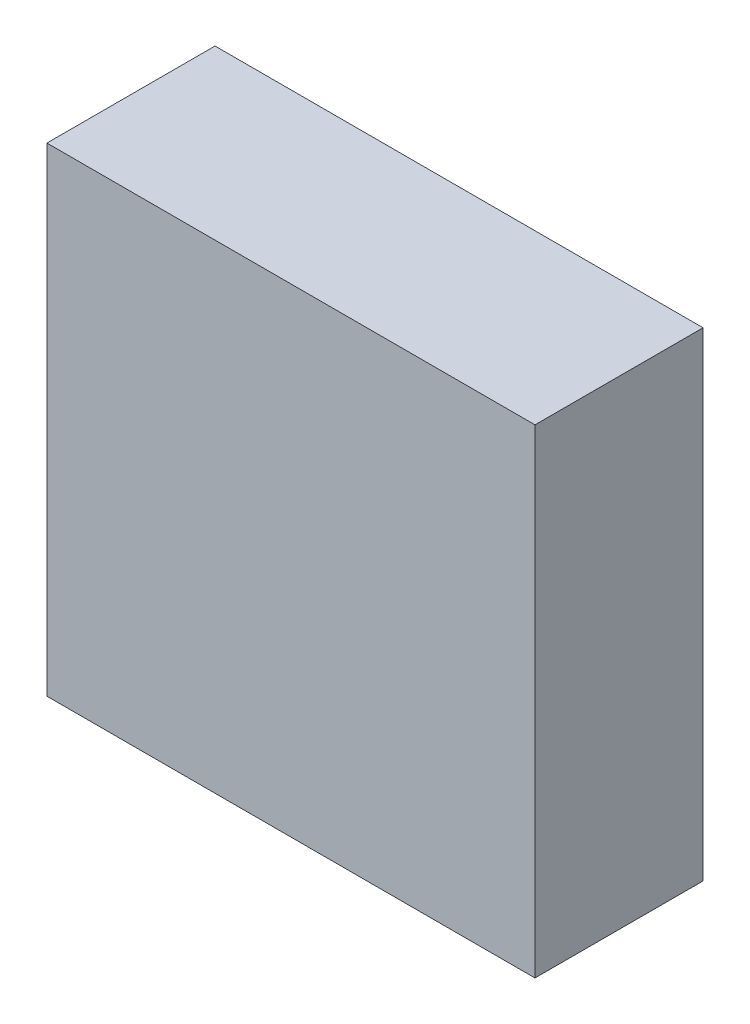
ISO-10303-21;
HEADER;
FILE_DESCRIPTION(('STEP AP214'),'2;1');
FILE_NAME('part.step','',(''),(''),'','','');
FILE_SCHEMA(('AUTOMOTIVE_DESIGN { 1 0 10303 214 1 1 1 1 }'));
ENDSEC;
DATA;
#1=APPLICATION_CONTEXT('core data for automotive mechanical design processes');
#2=APPLICATION_PROTOCOL_DEFINITION('international standard','automotive_design',2000,#1);
#3=PRODUCT_CONTEXT('',#1,'mechanical');
#4=PRODUCT('Part','Part','',(#3));
#5=PRODUCT_RELATED_PRODUCT_CATEGORY('part','',(#4));
#6=PRODUCT_DEFINITION_FORMATION('','',#4);
#7=PRODUCT_DEFINITION_CONTEXT('part definition',#1,'design');
#8=PRODUCT_DEFINITION('design','',#6,#7);
#9=PRODUCT_DEFINITION_SHAPE('','',#8);
#10=(LENGTH_UNIT() NAMED_UNIT(*) SI_UNIT(.MILLI.,.METRE.));
#11=(NAMED_UNIT(*) PLANE_ANGLE_UNIT() SI_UNIT($,.RADIAN.));
#12=(NAMED_UNIT(*) SI_UNIT($,.STERADIAN.) SOLID_ANGLE_UNIT());
#13=UNCERTAINTY_MEASURE_WITH_UNIT(LENGTH_MEASURE(1.E-05),#10,'distance_accuracy_value','');
#14=(GEOMETRIC_REPRESENTATION_CONTEXT(3) GLOBAL_UNCERTAINTY_ASSIGNED_CONTEXT((#13)) GLOBAL_UNIT_ASSIGNED_CONTEXT((#10,
#11,#12)) REPRESENTATION_CONTEXT('',''));
#15=CARTESIAN_POINT('',(0.,0.,0.));
#16=DIRECTION('',(0.,0.,1.));
#17=DIRECTION('',(1.,0.,0.));
#18=AXIS2_PLACEMENT_3D('',#15,#16,#17);
#19=CARTESIAN_POINT('',(-1.42,1.43,1.));
#20=DIRECTION('',(0.,0.,1.));
#21=DIRECTION('',(1.,0.,0.));
#22=AXIS2_PLACEMENT_3D('',#19,#20,#21);
#23=PLANE('',#22);
#24=DIRECTION('',(0.,1.,0.));
#25=VECTOR('',#24,1.);
#26=CARTESIAN_POINT('',(1.4835,1.43,1.));
#27=LINE('',#26,#25);
#28=CARTESIAN_POINT('',(1.4835,1.43,1.));
#29=VERTEX_POINT('',#28);
#30=CARTESIAN_POINT('',(1.4835,-1.42,1.));
#31=VERTEX_POINT('',#30);
#32=EDGE_CURVE('E53',#29,#31,#27,.F.);
#33=ORIENTED_EDGE('',*,*,#32,.F.);
#34=DIRECTION('',(1.,0.,0.));
#35=VECTOR('',#34,1.);
#36=CARTESIAN_POINT('',(-1.42,1.43,1.));
#37=LINE('',#36,#35);
#38=CARTESIAN_POINT('',(-1.42,1.43,1.));
#39=VERTEX_POINT('',#38);
#40=EDGE_CURVE('E68',#39,#29,#37,.T.);
#41=ORIENTED_EDGE('',*,*,#40,.F.);
#42=DIRECTION('',(0.,1.,0.));
#43=VECTOR('',#42,1.);
#44=CARTESIAN_POINT('',(-1.42,-1.42,1.));
#45=LINE('',#44,#43);
#46=CARTESIAN_POINT('',(-1.42,-1.42,1.));
#47=VERTEX_POINT('',#46);
#48=EDGE_CURVE('E20',#47,#39,#45,.T.);
#49=ORIENTED_EDGE('',*,*,#48,.F.);
#50=DIRECTION('',(1.,0.,0.));
#51=VECTOR('',#50,1.);
#52=CARTESIAN_POINT('',(1.4835,-1.42,1.));
#53=LINE('',#52,#51);
#54=EDGE_CURVE('E58',#31,#47,#53,.F.);
#55=ORIENTED_EDGE('',*,*,#54,.F.);
#56=EDGE_LOOP('',(#33,#41,#49,#55));
#57=FACE_BOUND('',#56,.T.);
#58=ADVANCED_FACE('F17',(#57),#23,.T.);
#59=CARTESIAN_POINT('',(-1.42,-1.42,0.));
#60=DIRECTION('',(-1.,0.,0.));
#61=DIRECTION('',(0.,0.,1.));
#62=AXIS2_PLACEMENT_3D('',#59,#60,#61);
#63=PLANE('',#62);
#64=DIRECTION('',(0.,0.,1.));
#65=VECTOR('',#64,1.);
#66=CARTESIAN_POINT('',(-1.42,1.43,0.));
#67=LINE('',#66,#65);
#68=CARTESIAN_POINT('',(-1.42,1.43,0.));
#69=VERTEX_POINT('',#68);
#70=EDGE_CURVE('E79',#69,#39,#67,.T.);
#71=ORIENTED_EDGE('',*,*,#70,.F.);
#72=DIRECTION('',(0.,1.,0.));
#73=VECTOR('',#72,1.);
#74=CARTESIAN_POINT('',(-1.42,1.43,0.));
#75=LINE('',#74,#73);
#76=CARTESIAN_POINT('',(-1.42,-1.42,0.));
#77=VERTEX_POINT('',#76);
#78=EDGE_CURVE('E74',#69,#77,#75,.F.);
#79=ORIENTED_EDGE('',*,*,#78,.T.);
#80=DIRECTION('',(0.,0.,-1.));
#81=VECTOR('',#80,1.);
#82=CARTESIAN_POINT('',(-1.42,-1.42,0.));
#83=LINE('',#82,#81);
#84=EDGE_CURVE('E63',#47,#77,#83,.T.);
#85=ORIENTED_EDGE('',*,*,#84,.F.);
#86=ORIENTED_EDGE('',*,*,#48,.T.);
#87=EDGE_LOOP('',(#71,#79,#85,#86));
#88=FACE_BOUND('',#87,.T.);
#89=ADVANCED_FACE('F73',(#88),#63,.T.);
#90=CARTESIAN_POINT('',(1.4835,-1.42,0.));
#91=DIRECTION('',(0.,-1.,0.));
#92=DIRECTION('',(0.,0.,-1.));
#93=AXIS2_PLACEMENT_3D('',#90,#91,#92);
#94=PLANE('',#93);
#95=ORIENTED_EDGE('',*,*,#84,.T.);
#96=DIRECTION('',(1.,0.,0.));
#97=VECTOR('',#96,1.);
#98=CARTESIAN_POINT('',(-1.42,-1.42,0.));
#99=LINE('',#98,#97);
#100=CARTESIAN_POINT('',(1.4835,-1.42,0.));
#101=VERTEX_POINT('',#100);
#102=EDGE_CURVE('E84',#77,#101,#99,.T.);
#103=ORIENTED_EDGE('',*,*,#102,.T.);
#104=DIRECTION('',(0.,0.,-1.));
#105=VECTOR('',#104,1.);
#106=CARTESIAN_POINT('',(1.4835,-1.42,0.));
#107=LINE('',#106,#105);
#108=EDGE_CURVE('E65',#31,#101,#107,.T.);
#109=ORIENTED_EDGE('',*,*,#108,.F.);
#110=ORIENTED_EDGE('',*,*,#54,.T.);
#111=EDGE_LOOP('',(#95,#103,#109,#110));
#112=FACE_BOUND('',#111,.T.);
#113=ADVANCED_FACE('F60',(#112),#94,.T.);
#114=CARTESIAN_POINT('',(1.4835,1.43,0.));
#115=DIRECTION('',(1.,0.,0.));
#116=DIRECTION('',(0.,0.,-1.));
#117=AXIS2_PLACEMENT_3D('',#114,#115,#116);
#118=PLANE('',#117);
#119=ORIENTED_EDGE('',*,*,#108,.T.);
#120=DIRECTION('',(0.,1.,0.));
#121=VECTOR('',#120,1.);
#122=CARTESIAN_POINT('',(1.4835,1.43,0.));
#123=LINE('',#122,#121);
#124=CARTESIAN_POINT('',(1.4835,1.43,0.));
#125=VERTEX_POINT('',#124);
#126=EDGE_CURVE('E26',#101,#125,#123,.T.);
#127=ORIENTED_EDGE('',*,*,#126,.T.);
#128=DIRECTION('',(0.,0.,1.));
#129=VECTOR('',#128,1.);
#130=CARTESIAN_POINT('',(1.4835,1.43,0.));
#131=LINE('',#130,#129);
#132=EDGE_CURVE('E34',#29,#125,#131,.F.);
#133=ORIENTED_EDGE('',*,*,#132,.F.);
#134=ORIENTED_EDGE('',*,*,#32,.T.);
#135=EDGE_LOOP('',(#119,#127,#133,#134));
#136=FACE_BOUND('',#135,.T.);
#137=ADVANCED_FACE('F88',(#136),#118,.T.);
#138=CARTESIAN_POINT('',(-1.42,1.43,0.));
#139=DIRECTION('',(0.,1.,0.));
#140=DIRECTION('',(0.,0.,1.));
#141=AXIS2_PLACEMENT_3D('',#138,#139,#140);
#142=PLANE('',#141);
#143=ORIENTED_EDGE('',*,*,#132,.T.);
#144=DIRECTION('',(1.,0.,0.));
#145=VECTOR('',#144,1.);
#146=CARTESIAN_POINT('',(-1.42,1.43,0.));
#147=LINE('',#146,#145);
#148=EDGE_CURVE('E11',#125,#69,#147,.F.);
#149=ORIENTED_EDGE('',*,*,#148,.T.);
#150=ORIENTED_EDGE('',*,*,#70,.T.);
#151=ORIENTED_EDGE('',*,*,#40,.T.);
#152=EDGE_LOOP('',(#143,#149,#150,#151));
#153=FACE_BOUND('',#152,.T.);
#154=ADVANCED_FACE('F91',(#153),#142,.T.);
#155=CARTESIAN_POINT('',(-1.42,1.43,0.));
#156=DIRECTION('',(0.,0.,1.));
#157=DIRECTION('',(1.,0.,0.));
#158=AXIS2_PLACEMENT_3D('',#155,#156,#157);
#159=PLANE('',#158);
#160=ORIENTED_EDGE('',*,*,#126,.F.);
#161=ORIENTED_EDGE('',*,*,#102,.F.);
#162=ORIENTED_EDGE('',*,*,#78,.F.);
#163=ORIENTED_EDGE('',*,*,#148,.F.);
#164=EDGE_LOOP('',(#160,#161,#162,#163));
#165=FACE_BOUND('',#164,.T.);
#166=ADVANCED_FACE('F90',(#165),#159,.F.);
#167=CLOSED_SHELL('',(#58,#89,#113,#137,#154,#166));
#168=MANIFOLD_SOLID_BREP('B1',#167);
#169=ADVANCED_BREP_SHAPE_REPRESENTATION('',(#18,#168),#14);
#170=SHAPE_DEFINITION_REPRESENTATION(#9,#169);
ENDSEC;
END-ISO-10303-21;
